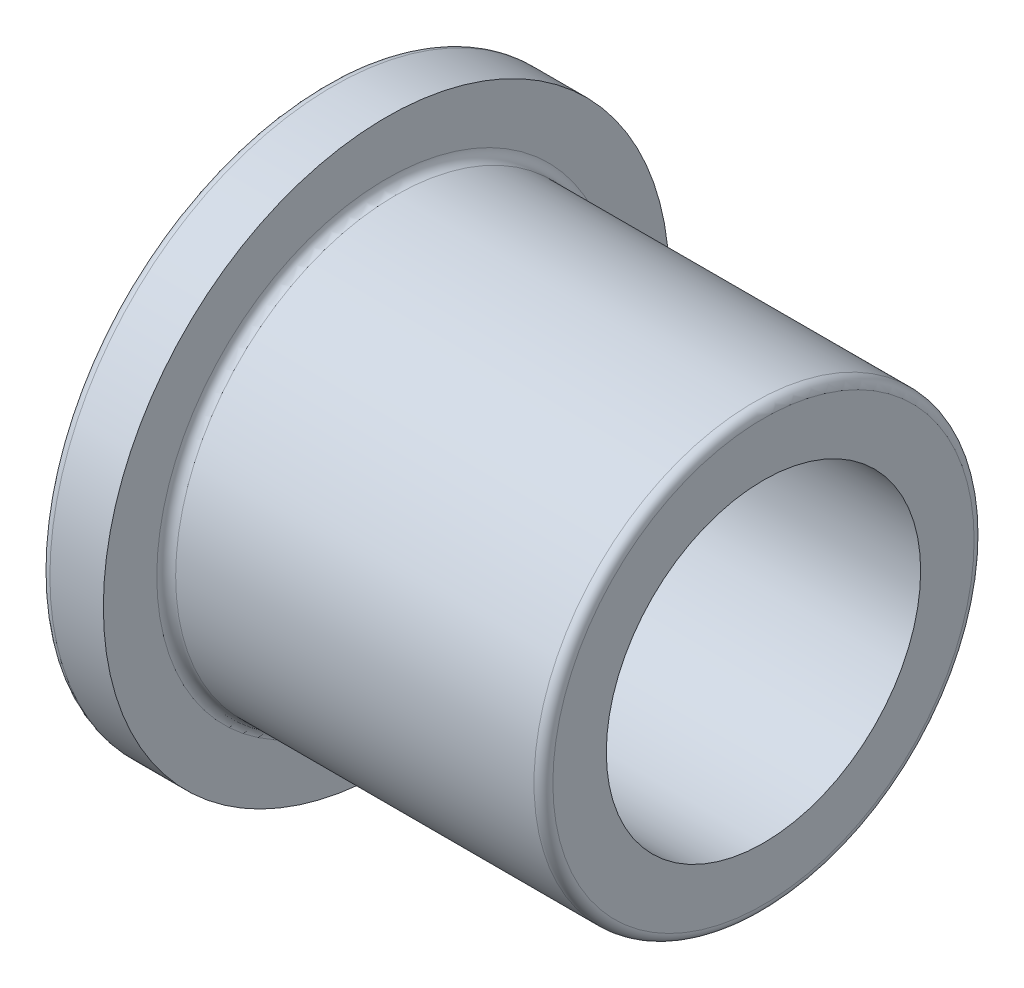
ISO-10303-21;
HEADER;
FILE_DESCRIPTION(('STEP AP214'),'2;1');
FILE_NAME('part.step','',(''),(''),'','','');
FILE_SCHEMA(('AUTOMOTIVE_DESIGN { 1 0 10303 214 1 1 1 1 }'));
ENDSEC;
DATA;
#1=APPLICATION_CONTEXT('core data for automotive mechanical design processes');
#2=APPLICATION_PROTOCOL_DEFINITION('international standard','automotive_design',2000,#1);
#3=PRODUCT_CONTEXT('',#1,'mechanical');
#4=PRODUCT('Part','Part','',(#3));
#5=PRODUCT_RELATED_PRODUCT_CATEGORY('part','',(#4));
#6=PRODUCT_DEFINITION_FORMATION('','',#4);
#7=PRODUCT_DEFINITION_CONTEXT('part definition',#1,'design');
#8=PRODUCT_DEFINITION('design','',#6,#7);
#9=PRODUCT_DEFINITION_SHAPE('','',#8);
#10=(LENGTH_UNIT() NAMED_UNIT(*) SI_UNIT(.MILLI.,.METRE.));
#11=(NAMED_UNIT(*) PLANE_ANGLE_UNIT() SI_UNIT($,.RADIAN.));
#12=(NAMED_UNIT(*) SI_UNIT($,.STERADIAN.) SOLID_ANGLE_UNIT());
#13=UNCERTAINTY_MEASURE_WITH_UNIT(LENGTH_MEASURE(1.E-05),#10,'distance_accuracy_value','');
#14=(GEOMETRIC_REPRESENTATION_CONTEXT(3) GLOBAL_UNCERTAINTY_ASSIGNED_CONTEXT((#13)) GLOBAL_UNIT_ASSIGNED_CONTEXT((#10,
#11,#12)) REPRESENTATION_CONTEXT('',''));
#15=CARTESIAN_POINT('',(0.,0.,0.));
#16=DIRECTION('',(0.,0.,1.));
#17=DIRECTION('',(1.,0.,0.));
#18=AXIS2_PLACEMENT_3D('',#15,#16,#17);
#19=CARTESIAN_POINT('',(-12.,0.,0.));
#20=DIRECTION('',(1.,0.,0.));
#21=DIRECTION('',(0.,0.,-1.));
#22=AXIS2_PLACEMENT_3D('',#19,#20,#21);
#23=CYLINDRICAL_SURFACE('',#22,7.);
#24=CARTESIAN_POINT('',(-0.3,0.,0.));
#25=DIRECTION('',(1.,0.,0.));
#26=DIRECTION('',(0.,0.,-1.));
#27=AXIS2_PLACEMENT_3D('',#24,#25,#26);
#28=CIRCLE('',#27,7.);
#29=CARTESIAN_POINT('',(-0.3,0.,-7.));
#30=VERTEX_POINT('',#29);
#31=EDGE_CURVE('E41',#30,#30,#28,.F.);
#32=ORIENTED_EDGE('',*,*,#31,.T.);
#33=EDGE_LOOP('',(#32));
#34=FACE_BOUND('',#33,.T.);
#35=CARTESIAN_POINT('',(-11.7,0.,0.));
#36=DIRECTION('',(-1.,0.,0.));
#37=DIRECTION('',(0.,0.,1.));
#38=AXIS2_PLACEMENT_3D('',#35,#36,#37);
#39=CIRCLE('',#38,7.);
#40=CARTESIAN_POINT('',(-11.7,0.,7.));
#41=VERTEX_POINT('',#40);
#42=EDGE_CURVE('E45',#41,#41,#39,.F.);
#43=ORIENTED_EDGE('',*,*,#42,.T.);
#44=EDGE_LOOP('',(#43));
#45=FACE_BOUND('',#44,.T.);
#46=ADVANCED_FACE('F34',(#34,#45),#23,.T.);
#47=CARTESIAN_POINT('',(0.,0.,0.));
#48=DIRECTION('',(1.,0.,0.));
#49=DIRECTION('',(0.,0.,-1.));
#50=AXIS2_PLACEMENT_3D('',#47,#48,#49);
#51=PLANE('',#50);
#52=CARTESIAN_POINT('',(0.,0.,0.));
#53=DIRECTION('',(1.,0.,0.));
#54=DIRECTION('',(0.,0.,-1.));
#55=AXIS2_PLACEMENT_3D('',#52,#53,#54);
#56=CIRCLE('',#55,6.7);
#57=CARTESIAN_POINT('',(0.,0.,-6.7));
#58=VERTEX_POINT('',#57);
#59=EDGE_CURVE('E49',#58,#58,#56,.T.);
#60=ORIENTED_EDGE('',*,*,#59,.T.);
#61=EDGE_LOOP('',(#60));
#62=FACE_BOUND('',#61,.T.);
#63=CARTESIAN_POINT('',(0.,0.,0.));
#64=DIRECTION('',(1.,0.,0.));
#65=DIRECTION('',(0.,0.,-1.));
#66=AXIS2_PLACEMENT_3D('',#63,#64,#65);
#67=CIRCLE('',#66,5.);
#68=CARTESIAN_POINT('',(0.,0.,-5.));
#69=VERTEX_POINT('',#68);
#70=EDGE_CURVE('E60',#69,#69,#67,.T.);
#71=ORIENTED_EDGE('',*,*,#70,.F.);
#72=EDGE_LOOP('',(#71));
#73=FACE_BOUND('',#72,.T.);
#74=ADVANCED_FACE('F83',(#62,#73),#51,.T.);
#75=CARTESIAN_POINT('',(-12.,0.,0.));
#76=DIRECTION('',(1.,0.,0.));
#77=DIRECTION('',(0.,0.,-1.));
#78=AXIS2_PLACEMENT_3D('',#75,#76,#77);
#79=CYLINDRICAL_SURFACE('',#78,5.);
#80=ORIENTED_EDGE('',*,*,#70,.T.);
#81=EDGE_LOOP('',(#80));
#82=FACE_BOUND('',#81,.T.);
#83=CARTESIAN_POINT('',(-14.,0.,0.));
#84=DIRECTION('',(-1.,0.,0.));
#85=DIRECTION('',(0.,0.,1.));
#86=AXIS2_PLACEMENT_3D('',#83,#84,#85);
#87=CIRCLE('',#86,5.);
#88=CARTESIAN_POINT('',(-14.,0.,5.));
#89=VERTEX_POINT('',#88);
#90=EDGE_CURVE('E66',#89,#89,#87,.T.);
#91=ORIENTED_EDGE('',*,*,#90,.T.);
#92=EDGE_LOOP('',(#91));
#93=FACE_BOUND('',#92,.T.);
#94=ADVANCED_FACE('F70',(#82,#93),#79,.F.);
#95=CARTESIAN_POINT('',(-14.,0.,0.));
#96=DIRECTION('',(-1.,0.,0.));
#97=DIRECTION('',(0.,0.,1.));
#98=AXIS2_PLACEMENT_3D('',#95,#96,#97);
#99=PLANE('',#98);
#100=CARTESIAN_POINT('',(-14.,0.,0.));
#101=DIRECTION('',(-1.,0.,0.));
#102=DIRECTION('',(0.,0.,1.));
#103=AXIS2_PLACEMENT_3D('',#100,#101,#102);
#104=CIRCLE('',#103,8.7);
#105=CARTESIAN_POINT('',(-14.,0.,8.7));
#106=VERTEX_POINT('',#105);
#107=EDGE_CURVE('E57',#106,#106,#104,.T.);
#108=ORIENTED_EDGE('',*,*,#107,.T.);
#109=EDGE_LOOP('',(#108));
#110=FACE_BOUND('',#109,.T.);
#111=ORIENTED_EDGE('',*,*,#90,.F.);
#112=EDGE_LOOP('',(#111));
#113=FACE_BOUND('',#112,.T.);
#114=ADVANCED_FACE('F72',(#110,#113),#99,.T.);
#115=CARTESIAN_POINT('',(-12.,0.,0.));
#116=DIRECTION('',(-1.,0.,0.));
#117=DIRECTION('',(0.,0.,1.));
#118=AXIS2_PLACEMENT_3D('',#115,#116,#117);
#119=PLANE('',#118);
#120=CARTESIAN_POINT('',(-12.,0.,0.));
#121=DIRECTION('',(-1.,0.,0.));
#122=DIRECTION('',(0.,0.,1.));
#123=AXIS2_PLACEMENT_3D('',#120,#121,#122);
#124=CIRCLE('',#123,7.3);
#125=CARTESIAN_POINT('',(-12.,0.,7.3));
#126=VERTEX_POINT('',#125);
#127=EDGE_CURVE('E10',#126,#126,#124,.T.);
#128=ORIENTED_EDGE('',*,*,#127,.T.);
#129=EDGE_LOOP('',(#128));
#130=FACE_BOUND('',#129,.T.);
#131=CARTESIAN_POINT('',(-12.,0.,0.));
#132=DIRECTION('',(-1.,0.,0.));
#133=DIRECTION('',(0.,0.,1.));
#134=AXIS2_PLACEMENT_3D('',#131,#132,#133);
#135=CIRCLE('',#134,9.);
#136=CARTESIAN_POINT('',(-12.,0.,9.));
#137=VERTEX_POINT('',#136);
#138=EDGE_CURVE('E63',#137,#137,#135,.T.);
#139=ORIENTED_EDGE('',*,*,#138,.F.);
#140=EDGE_LOOP('',(#139));
#141=FACE_BOUND('',#140,.T.);
#142=ADVANCED_FACE('F74',(#130,#141),#119,.F.);
#143=CARTESIAN_POINT('',(-14.,0.,0.));
#144=DIRECTION('',(1.,0.,0.));
#145=DIRECTION('',(0.,0.,-1.));
#146=AXIS2_PLACEMENT_3D('',#143,#144,#145);
#147=CYLINDRICAL_SURFACE('',#146,9.);
#148=CARTESIAN_POINT('',(-13.7,0.,0.));
#149=DIRECTION('',(-1.,0.,0.));
#150=DIRECTION('',(0.,0.,1.));
#151=AXIS2_PLACEMENT_3D('',#148,#149,#150);
#152=CIRCLE('',#151,9.);
#153=CARTESIAN_POINT('',(-13.7,0.,9.));
#154=VERTEX_POINT('',#153);
#155=EDGE_CURVE('E54',#154,#154,#152,.F.);
#156=ORIENTED_EDGE('',*,*,#155,.T.);
#157=EDGE_LOOP('',(#156));
#158=FACE_BOUND('',#157,.T.);
#159=ORIENTED_EDGE('',*,*,#138,.T.);
#160=EDGE_LOOP('',(#159));
#161=FACE_BOUND('',#160,.T.);
#162=ADVANCED_FACE('F81',(#158,#161),#147,.T.);
#163=CARTESIAN_POINT('',(-13.7,0.,0.));
#164=DIRECTION('',(-1.,0.,0.));
#165=DIRECTION('',(0.,0.,1.));
#166=AXIS2_PLACEMENT_3D('',#163,#164,#165);
#167=TOROIDAL_SURFACE('',#166,8.7,0.3);
#168=ORIENTED_EDGE('',*,*,#155,.F.);
#169=EDGE_LOOP('',(#168));
#170=FACE_BOUND('',#169,.T.);
#171=ORIENTED_EDGE('',*,*,#107,.F.);
#172=EDGE_LOOP('',(#171));
#173=FACE_BOUND('',#172,.T.);
#174=ADVANCED_FACE('F95',(#170,#173),#167,.T.);
#175=CARTESIAN_POINT('',(-0.3,0.,0.));
#176=DIRECTION('',(1.,0.,0.));
#177=DIRECTION('',(0.,0.,-1.));
#178=AXIS2_PLACEMENT_3D('',#175,#176,#177);
#179=TOROIDAL_SURFACE('',#178,6.7,0.3);
#180=ORIENTED_EDGE('',*,*,#31,.F.);
#181=EDGE_LOOP('',(#180));
#182=FACE_BOUND('',#181,.T.);
#183=ORIENTED_EDGE('',*,*,#59,.F.);
#184=EDGE_LOOP('',(#183));
#185=FACE_BOUND('',#184,.T.);
#186=ADVANCED_FACE('F97',(#182,#185),#179,.T.);
#187=CARTESIAN_POINT('',(-11.7,0.,0.));
#188=DIRECTION('',(-1.,0.,0.));
#189=DIRECTION('',(0.,0.,1.));
#190=AXIS2_PLACEMENT_3D('',#187,#188,#189);
#191=TOROIDAL_SURFACE('',#190,7.3,0.3);
#192=ORIENTED_EDGE('',*,*,#127,.F.);
#193=EDGE_LOOP('',(#192));
#194=FACE_BOUND('',#193,.T.);
#195=ORIENTED_EDGE('',*,*,#42,.F.);
#196=EDGE_LOOP('',(#195));
#197=FACE_BOUND('',#196,.T.);
#198=ADVANCED_FACE('F36',(#194,#197),#191,.F.);
#199=CLOSED_SHELL('',(#46,#74,#94,#114,#142,#162,#174,#186,#198));
#200=MANIFOLD_SOLID_BREP('B2',#199);
#201=ADVANCED_BREP_SHAPE_REPRESENTATION('',(#18,#200),#14);
#202=SHAPE_DEFINITION_REPRESENTATION(#9,#201);
ENDSEC;
END-ISO-10303-21;
